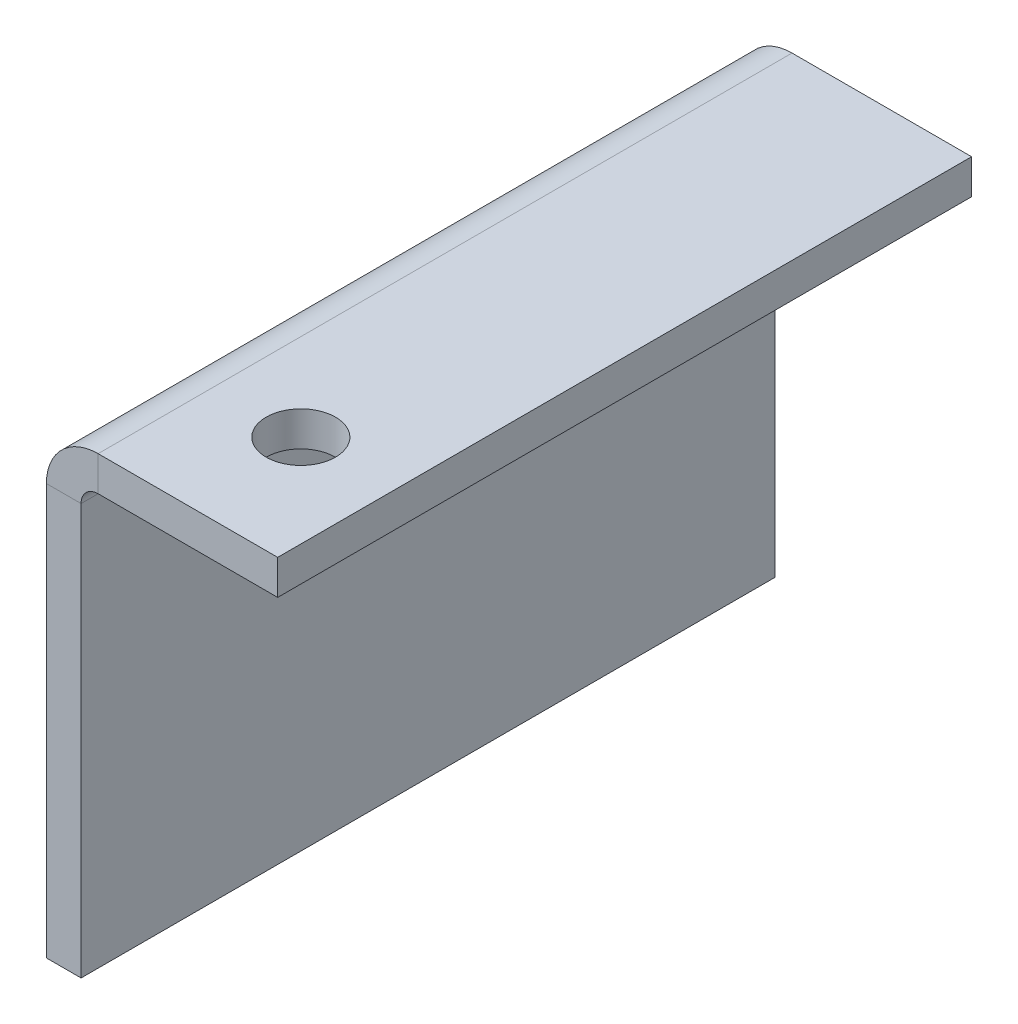
ISO-10303-21;
HEADER;
FILE_DESCRIPTION(('STEP AP214'),'2;1');
FILE_NAME('part.step','',(''),(''),'','','');
FILE_SCHEMA(('AUTOMOTIVE_DESIGN { 1 0 10303 214 1 1 1 1 }'));
ENDSEC;
DATA;
#1=APPLICATION_CONTEXT('core data for automotive mechanical design processes');
#2=APPLICATION_PROTOCOL_DEFINITION('international standard','automotive_design',2000,#1);
#3=PRODUCT_CONTEXT('',#1,'mechanical');
#4=PRODUCT('Part','Part','',(#3));
#5=PRODUCT_RELATED_PRODUCT_CATEGORY('part','',(#4));
#6=PRODUCT_DEFINITION_FORMATION('','',#4);
#7=PRODUCT_DEFINITION_CONTEXT('part definition',#1,'design');
#8=PRODUCT_DEFINITION('design','',#6,#7);
#9=PRODUCT_DEFINITION_SHAPE('','',#8);
#10=(LENGTH_UNIT() NAMED_UNIT(*) SI_UNIT(.MILLI.,.METRE.));
#11=(NAMED_UNIT(*) PLANE_ANGLE_UNIT() SI_UNIT($,.RADIAN.));
#12=(NAMED_UNIT(*) SI_UNIT($,.STERADIAN.) SOLID_ANGLE_UNIT());
#13=UNCERTAINTY_MEASURE_WITH_UNIT(LENGTH_MEASURE(1.E-05),#10,'distance_accuracy_value','');
#14=(GEOMETRIC_REPRESENTATION_CONTEXT(3) GLOBAL_UNCERTAINTY_ASSIGNED_CONTEXT((#13)) GLOBAL_UNIT_ASSIGNED_CONTEXT((#10,
#11,#12)) REPRESENTATION_CONTEXT('',''));
#15=CARTESIAN_POINT('',(0.,0.,0.));
#16=DIRECTION('',(0.,0.,1.));
#17=DIRECTION('',(1.,0.,0.));
#18=AXIS2_PLACEMENT_3D('',#15,#16,#17);
#19=CARTESIAN_POINT('',(2.23659999999994,20.,30.));
#20=DIRECTION('',(0.,0.,1.));
#21=DIRECTION('',(1.,0.,0.));
#22=AXIS2_PLACEMENT_3D('',#19,#20,#21);
#23=PLANE('',#22);
#24=DIRECTION('',(0.,-1.,0.));
#25=VECTOR('',#24,1.);
#26=CARTESIAN_POINT('',(2.23659999999994,20.,30.));
#27=LINE('',#26,#25);
#28=CARTESIAN_POINT('',(2.23659999999994,20.,30.));
#29=VERTEX_POINT('',#28);
#30=CARTESIAN_POINT('',(2.23659999999994,18.5,30.));
#31=VERTEX_POINT('',#30);
#32=EDGE_CURVE('E13',#29,#31,#27,.T.);
#33=ORIENTED_EDGE('',*,*,#32,.F.);
#34=CARTESIAN_POINT('',(2.23659999999994,17.7634,30.));
#35=DIRECTION('',(0.,0.,1.));
#36=DIRECTION('',(1.,0.,0.));
#37=AXIS2_PLACEMENT_3D('',#34,#35,#36);
#38=CIRCLE('',#37,2.2366);
#39=CARTESIAN_POINT('',(0.,17.7634,30.));
#40=VERTEX_POINT('',#39);
#41=EDGE_CURVE('E145',#40,#29,#38,.F.);
#42=ORIENTED_EDGE('',*,*,#41,.F.);
#43=DIRECTION('',(-1.,0.,0.));
#44=VECTOR('',#43,1.);
#45=CARTESIAN_POINT('',(1.49999999999994,17.7634,30.));
#46=LINE('',#45,#44);
#47=CARTESIAN_POINT('',(1.49999999999994,17.7634,30.));
#48=VERTEX_POINT('',#47);
#49=EDGE_CURVE('E56',#48,#40,#46,.T.);
#50=ORIENTED_EDGE('',*,*,#49,.F.);
#51=CARTESIAN_POINT('',(2.23659999999994,17.7634,30.));
#52=DIRECTION('',(0.,0.,1.));
#53=DIRECTION('',(1.,0.,0.));
#54=AXIS2_PLACEMENT_3D('',#51,#52,#53);
#55=CIRCLE('',#54,0.7366);
#56=EDGE_CURVE('E138',#48,#31,#55,.F.);
#57=ORIENTED_EDGE('',*,*,#56,.T.);
#58=EDGE_LOOP('',(#33,#42,#50,#57));
#59=FACE_BOUND('',#58,.T.);
#60=ADVANCED_FACE('F48',(#59),#23,.T.);
#61=CARTESIAN_POINT('',(1.49999999999994,17.7634,30.));
#62=DIRECTION('',(0.,0.,1.));
#63=DIRECTION('',(1.,0.,0.));
#64=AXIS2_PLACEMENT_3D('',#61,#62,#63);
#65=PLANE('',#64);
#66=DIRECTION('',(1.,0.,0.));
#67=VECTOR('',#66,1.);
#68=CARTESIAN_POINT('',(0.,20.,30.));
#69=LINE('',#68,#67);
#70=CARTESIAN_POINT('',(9.99999999999993,20.,30.));
#71=VERTEX_POINT('',#70);
#72=EDGE_CURVE('E195',#29,#71,#69,.T.);
#73=ORIENTED_EDGE('',*,*,#72,.F.);
#74=ORIENTED_EDGE('',*,*,#32,.T.);
#75=DIRECTION('',(1.,0.,0.));
#76=VECTOR('',#75,1.);
#77=CARTESIAN_POINT('',(0.,18.5,30.));
#78=LINE('',#77,#76);
#79=CARTESIAN_POINT('',(9.99999999999993,18.5,30.));
#80=VERTEX_POINT('',#79);
#81=EDGE_CURVE('E104',#31,#80,#78,.T.);
#82=ORIENTED_EDGE('',*,*,#81,.T.);
#83=DIRECTION('',(0.,-1.,0.));
#84=VECTOR('',#83,1.);
#85=CARTESIAN_POINT('',(9.99999999999993,20.,30.));
#86=LINE('',#85,#84);
#87=EDGE_CURVE('E346',#71,#80,#86,.T.);
#88=ORIENTED_EDGE('',*,*,#87,.F.);
#89=EDGE_LOOP('',(#73,#74,#82,#88));
#90=FACE_BOUND('',#89,.T.);
#91=ADVANCED_FACE('F203',(#90),#65,.T.);
#92=CARTESIAN_POINT('',(0.,17.7634,0.));
#93=DIRECTION('',(0.,0.,-1.));
#94=DIRECTION('',(-1.,0.,0.));
#95=AXIS2_PLACEMENT_3D('',#92,#93,#94);
#96=PLANE('',#95);
#97=DIRECTION('',(1.,0.,0.));
#98=VECTOR('',#97,1.);
#99=CARTESIAN_POINT('',(0.,17.7634,0.));
#100=LINE('',#99,#98);
#101=CARTESIAN_POINT('',(0.,17.7634,0.));
#102=VERTEX_POINT('',#101);
#103=CARTESIAN_POINT('',(1.49999999999994,17.7634,0.));
#104=VERTEX_POINT('',#103);
#105=EDGE_CURVE('E91',#102,#104,#100,.T.);
#106=ORIENTED_EDGE('',*,*,#105,.F.);
#107=CARTESIAN_POINT('',(2.23659999999994,17.7634,0.));
#108=DIRECTION('',(0.,0.,1.));
#109=DIRECTION('',(1.,0.,0.));
#110=AXIS2_PLACEMENT_3D('',#107,#108,#109);
#111=CIRCLE('',#110,2.2366);
#112=CARTESIAN_POINT('',(2.23659999999994,20.,0.));
#113=VERTEX_POINT('',#112);
#114=EDGE_CURVE('E161',#102,#113,#111,.F.);
#115=ORIENTED_EDGE('',*,*,#114,.T.);
#116=DIRECTION('',(0.,1.,0.));
#117=VECTOR('',#116,1.);
#118=CARTESIAN_POINT('',(2.23659999999994,18.5,0.));
#119=LINE('',#118,#117);
#120=CARTESIAN_POINT('',(2.23659999999994,18.5,0.));
#121=VERTEX_POINT('',#120);
#122=EDGE_CURVE('E98',#121,#113,#119,.T.);
#123=ORIENTED_EDGE('',*,*,#122,.F.);
#124=CARTESIAN_POINT('',(2.23659999999994,17.7634,0.));
#125=DIRECTION('',(0.,0.,1.));
#126=DIRECTION('',(1.,0.,0.));
#127=AXIS2_PLACEMENT_3D('',#124,#125,#126);
#128=CIRCLE('',#127,0.7366);
#129=EDGE_CURVE('E168',#104,#121,#128,.F.);
#130=ORIENTED_EDGE('',*,*,#129,.F.);
#131=EDGE_LOOP('',(#106,#115,#123,#130));
#132=FACE_BOUND('',#131,.T.);
#133=ADVANCED_FACE('F201',(#132),#96,.T.);
#134=CARTESIAN_POINT('',(2.23659999999994,18.5,0.));
#135=DIRECTION('',(0.,0.,-1.));
#136=DIRECTION('',(-1.,0.,0.));
#137=AXIS2_PLACEMENT_3D('',#134,#135,#136);
#138=PLANE('',#137);
#139=DIRECTION('',(0.,1.,0.));
#140=VECTOR('',#139,1.);
#141=CARTESIAN_POINT('',(0.,0.,0.));
#142=LINE('',#141,#140);
#143=CARTESIAN_POINT('',(0.,0.,0.));
#144=VERTEX_POINT('',#143);
#145=EDGE_CURVE('E163',#144,#102,#142,.T.);
#146=ORIENTED_EDGE('',*,*,#145,.T.);
#147=ORIENTED_EDGE('',*,*,#105,.T.);
#148=DIRECTION('',(0.,1.,0.));
#149=VECTOR('',#148,1.);
#150=CARTESIAN_POINT('',(1.5,0.,0.));
#151=LINE('',#150,#149);
#152=CARTESIAN_POINT('',(1.5,0.,0.));
#153=VERTEX_POINT('',#152);
#154=EDGE_CURVE('E166',#153,#104,#151,.T.);
#155=ORIENTED_EDGE('',*,*,#154,.F.);
#156=DIRECTION('',(-1.,0.,0.));
#157=VECTOR('',#156,1.);
#158=CARTESIAN_POINT('',(1.5,0.,0.));
#159=LINE('',#158,#157);
#160=EDGE_CURVE('E126',#153,#144,#159,.T.);
#161=ORIENTED_EDGE('',*,*,#160,.T.);
#162=EDGE_LOOP('',(#146,#147,#155,#161));
#163=FACE_BOUND('',#162,.T.);
#164=ADVANCED_FACE('F197',(#163),#138,.T.);
#165=CARTESIAN_POINT('',(0.,18.5,30.));
#166=DIRECTION('',(0.,1.,0.));
#167=DIRECTION('',(0.,0.,1.));
#168=AXIS2_PLACEMENT_3D('',#165,#166,#167);
#169=PLANE('',#168);
#170=CARTESIAN_POINT('',(5.99999999999993,18.5,25.));
#171=DIRECTION('',(0.,-1.,0.));
#172=DIRECTION('',(0.,0.,-1.));
#173=AXIS2_PLACEMENT_3D('',#170,#171,#172);
#174=CIRCLE('',#173,1.49999999999999);
#175=CARTESIAN_POINT('',(5.99999999999993,18.5,23.5));
#176=VERTEX_POINT('',#175);
#177=EDGE_CURVE('E341',#176,#176,#174,.T.);
#178=ORIENTED_EDGE('',*,*,#177,.F.);
#179=EDGE_LOOP('',(#178));
#180=FACE_BOUND('',#179,.T.);
#181=DIRECTION('',(1.,0.,0.));
#182=VECTOR('',#181,1.);
#183=CARTESIAN_POINT('',(0.,18.5,0.));
#184=LINE('',#183,#182);
#185=CARTESIAN_POINT('',(9.99999999999993,18.5,0.));
#186=VERTEX_POINT('',#185);
#187=EDGE_CURVE('E151',#121,#186,#184,.T.);
#188=ORIENTED_EDGE('',*,*,#187,.T.);
#189=DIRECTION('',(0.,0.,-1.));
#190=VECTOR('',#189,1.);
#191=CARTESIAN_POINT('',(9.99999999999993,18.5,30.));
#192=LINE('',#191,#190);
#193=EDGE_CURVE('E182',#80,#186,#192,.T.);
#194=ORIENTED_EDGE('',*,*,#193,.F.);
#195=ORIENTED_EDGE('',*,*,#81,.F.);
#196=DIRECTION('',(0.,0.,-1.));
#197=VECTOR('',#196,1.);
#198=CARTESIAN_POINT('',(2.23659999999994,18.5,30.));
#199=LINE('',#198,#197);
#200=EDGE_CURVE('E150',#31,#121,#199,.T.);
#201=ORIENTED_EDGE('',*,*,#200,.T.);
#202=EDGE_LOOP('',(#188,#194,#195,#201));
#203=FACE_BOUND('',#202,.T.);
#204=ADVANCED_FACE('F209',(#180,#203),#169,.F.);
#205=CARTESIAN_POINT('',(9.99999999999993,20.,30.));
#206=DIRECTION('',(1.,0.,0.));
#207=DIRECTION('',(0.,0.,-1.));
#208=AXIS2_PLACEMENT_3D('',#205,#206,#207);
#209=PLANE('',#208);
#210=DIRECTION('',(0.,-1.,0.));
#211=VECTOR('',#210,1.);
#212=CARTESIAN_POINT('',(9.99999999999993,20.,0.));
#213=LINE('',#212,#211);
#214=CARTESIAN_POINT('',(9.99999999999993,20.,0.));
#215=VERTEX_POINT('',#214);
#216=EDGE_CURVE('E154',#215,#186,#213,.T.);
#217=ORIENTED_EDGE('',*,*,#216,.F.);
#218=DIRECTION('',(0.,0.,-1.));
#219=VECTOR('',#218,1.);
#220=CARTESIAN_POINT('',(9.99999999999993,20.,30.));
#221=LINE('',#220,#219);
#222=EDGE_CURVE('E180',#71,#215,#221,.T.);
#223=ORIENTED_EDGE('',*,*,#222,.F.);
#224=ORIENTED_EDGE('',*,*,#87,.T.);
#225=ORIENTED_EDGE('',*,*,#193,.T.);
#226=EDGE_LOOP('',(#217,#223,#224,#225));
#227=FACE_BOUND('',#226,.T.);
#228=ADVANCED_FACE('F238',(#227),#209,.T.);
#229=CARTESIAN_POINT('',(0.,20.,30.));
#230=DIRECTION('',(0.,1.,0.));
#231=DIRECTION('',(0.,0.,1.));
#232=AXIS2_PLACEMENT_3D('',#229,#230,#231);
#233=PLANE('',#232);
#234=CARTESIAN_POINT('',(5.99999999999993,20.,25.));
#235=DIRECTION('',(0.,-1.,0.));
#236=DIRECTION('',(0.,0.,-1.));
#237=AXIS2_PLACEMENT_3D('',#234,#235,#236);
#238=CIRCLE('',#237,1.5);
#239=CARTESIAN_POINT('',(5.99999999999993,20.,23.5));
#240=VERTEX_POINT('',#239);
#241=EDGE_CURVE('E155',#240,#240,#238,.T.);
#242=ORIENTED_EDGE('',*,*,#241,.T.);
#243=EDGE_LOOP('',(#242));
#244=FACE_BOUND('',#243,.T.);
#245=DIRECTION('',(1.,0.,0.));
#246=VECTOR('',#245,1.);
#247=CARTESIAN_POINT('',(0.,20.,0.));
#248=LINE('',#247,#246);
#249=EDGE_CURVE('E158',#113,#215,#248,.T.);
#250=ORIENTED_EDGE('',*,*,#249,.F.);
#251=DIRECTION('',(0.,0.,-1.));
#252=VECTOR('',#251,1.);
#253=CARTESIAN_POINT('',(2.23659999999994,20.,30.));
#254=LINE('',#253,#252);
#255=EDGE_CURVE('E177',#29,#113,#254,.T.);
#256=ORIENTED_EDGE('',*,*,#255,.F.);
#257=ORIENTED_EDGE('',*,*,#72,.T.);
#258=ORIENTED_EDGE('',*,*,#222,.T.);
#259=EDGE_LOOP('',(#250,#256,#257,#258));
#260=FACE_BOUND('',#259,.T.);
#261=ADVANCED_FACE('F243',(#244,#260),#233,.T.);
#262=CARTESIAN_POINT('',(2.23659999999994,17.7634,30.));
#263=DIRECTION('',(0.,0.,-1.));
#264=DIRECTION('',(-1.,0.,0.));
#265=AXIS2_PLACEMENT_3D('',#262,#263,#264);
#266=CYLINDRICAL_SURFACE('',#265,2.2366);
#267=ORIENTED_EDGE('',*,*,#114,.F.);
#268=DIRECTION('',(0.,0.,-1.));
#269=VECTOR('',#268,1.);
#270=CARTESIAN_POINT('',(0.,17.7634,30.));
#271=LINE('',#270,#269);
#272=EDGE_CURVE('E174',#40,#102,#271,.T.);
#273=ORIENTED_EDGE('',*,*,#272,.F.);
#274=ORIENTED_EDGE('',*,*,#41,.T.);
#275=ORIENTED_EDGE('',*,*,#255,.T.);
#276=EDGE_LOOP('',(#267,#273,#274,#275));
#277=FACE_BOUND('',#276,.T.);
#278=ADVANCED_FACE('F191',(#277),#266,.T.);
#279=CARTESIAN_POINT('',(0.,0.,30.));
#280=DIRECTION('',(-1.,0.,0.));
#281=DIRECTION('',(0.,-1.,0.));
#282=AXIS2_PLACEMENT_3D('',#279,#280,#281);
#283=PLANE('',#282);
#284=ORIENTED_EDGE('',*,*,#145,.F.);
#285=DIRECTION('',(0.,0.,-1.));
#286=VECTOR('',#285,1.);
#287=CARTESIAN_POINT('',(0.,0.,30.));
#288=LINE('',#287,#286);
#289=CARTESIAN_POINT('',(0.,0.,30.));
#290=VERTEX_POINT('',#289);
#291=EDGE_CURVE('E128',#290,#144,#288,.T.);
#292=ORIENTED_EDGE('',*,*,#291,.F.);
#293=DIRECTION('',(0.,1.,0.));
#294=VECTOR('',#293,1.);
#295=CARTESIAN_POINT('',(0.,0.,30.));
#296=LINE('',#295,#294);
#297=EDGE_CURVE('E143',#290,#40,#296,.T.);
#298=ORIENTED_EDGE('',*,*,#297,.T.);
#299=ORIENTED_EDGE('',*,*,#272,.T.);
#300=EDGE_LOOP('',(#284,#292,#298,#299));
#301=FACE_BOUND('',#300,.T.);
#302=ADVANCED_FACE('F196',(#301),#283,.T.);
#303=CARTESIAN_POINT('',(1.5,0.,30.));
#304=DIRECTION('',(0.,-1.,0.));
#305=DIRECTION('',(1.,0.,0.));
#306=AXIS2_PLACEMENT_3D('',#303,#304,#305);
#307=PLANE('',#306);
#308=ORIENTED_EDGE('',*,*,#160,.F.);
#309=DIRECTION('',(0.,0.,-1.));
#310=VECTOR('',#309,1.);
#311=CARTESIAN_POINT('',(1.5,0.,30.));
#312=LINE('',#311,#310);
#313=CARTESIAN_POINT('',(1.5,0.,30.));
#314=VERTEX_POINT('',#313);
#315=EDGE_CURVE('E120',#314,#153,#312,.T.);
#316=ORIENTED_EDGE('',*,*,#315,.F.);
#317=DIRECTION('',(-1.,0.,0.));
#318=VECTOR('',#317,1.);
#319=CARTESIAN_POINT('',(1.5,0.,30.));
#320=LINE('',#319,#318);
#321=EDGE_CURVE('E124',#314,#290,#320,.T.);
#322=ORIENTED_EDGE('',*,*,#321,.T.);
#323=ORIENTED_EDGE('',*,*,#291,.T.);
#324=EDGE_LOOP('',(#308,#316,#322,#323));
#325=FACE_BOUND('',#324,.T.);
#326=ADVANCED_FACE('F122',(#325),#307,.T.);
#327=CARTESIAN_POINT('',(1.5,0.,30.));
#328=DIRECTION('',(-1.,0.,0.));
#329=DIRECTION('',(0.,-1.,0.));
#330=AXIS2_PLACEMENT_3D('',#327,#328,#329);
#331=PLANE('',#330);
#332=ORIENTED_EDGE('',*,*,#154,.T.);
#333=DIRECTION('',(0.,0.,-1.));
#334=VECTOR('',#333,1.);
#335=CARTESIAN_POINT('',(1.49999999999994,17.7634,30.));
#336=LINE('',#335,#334);
#337=EDGE_CURVE('E129',#48,#104,#336,.T.);
#338=ORIENTED_EDGE('',*,*,#337,.F.);
#339=DIRECTION('',(0.,1.,0.));
#340=VECTOR('',#339,1.);
#341=CARTESIAN_POINT('',(1.5,0.,30.));
#342=LINE('',#341,#340);
#343=EDGE_CURVE('E133',#314,#48,#342,.T.);
#344=ORIENTED_EDGE('',*,*,#343,.F.);
#345=ORIENTED_EDGE('',*,*,#315,.T.);
#346=EDGE_LOOP('',(#332,#338,#344,#345));
#347=FACE_BOUND('',#346,.T.);
#348=ADVANCED_FACE('F134',(#347),#331,.F.);
#349=CARTESIAN_POINT('',(2.23659999999994,17.7634,30.));
#350=DIRECTION('',(0.,0.,-1.));
#351=DIRECTION('',(-1.,0.,0.));
#352=AXIS2_PLACEMENT_3D('',#349,#350,#351);
#353=CYLINDRICAL_SURFACE('',#352,0.7366);
#354=ORIENTED_EDGE('',*,*,#129,.T.);
#355=ORIENTED_EDGE('',*,*,#200,.F.);
#356=ORIENTED_EDGE('',*,*,#56,.F.);
#357=ORIENTED_EDGE('',*,*,#337,.T.);
#358=EDGE_LOOP('',(#354,#355,#356,#357));
#359=FACE_BOUND('',#358,.T.);
#360=ADVANCED_FACE('F199',(#359),#353,.F.);
#361=CARTESIAN_POINT('',(2.23659999999994,17.7634,30.));
#362=DIRECTION('',(0.,0.,1.));
#363=DIRECTION('',(1.,0.,0.));
#364=AXIS2_PLACEMENT_3D('',#361,#362,#363);
#365=PLANE('',#364);
#366=ORIENTED_EDGE('',*,*,#343,.T.);
#367=ORIENTED_EDGE('',*,*,#49,.T.);
#368=ORIENTED_EDGE('',*,*,#297,.F.);
#369=ORIENTED_EDGE('',*,*,#321,.F.);
#370=EDGE_LOOP('',(#366,#367,#368,#369));
#371=FACE_BOUND('',#370,.T.);
#372=ADVANCED_FACE('F141',(#371),#365,.T.);
#373=CARTESIAN_POINT('',(2.23659999999994,17.7634,0.));
#374=DIRECTION('',(0.,0.,1.));
#375=DIRECTION('',(1.,0.,0.));
#376=AXIS2_PLACEMENT_3D('',#373,#374,#375);
#377=PLANE('',#376);
#378=ORIENTED_EDGE('',*,*,#187,.F.);
#379=ORIENTED_EDGE('',*,*,#122,.T.);
#380=ORIENTED_EDGE('',*,*,#249,.T.);
#381=ORIENTED_EDGE('',*,*,#216,.T.);
#382=EDGE_LOOP('',(#378,#379,#380,#381));
#383=FACE_BOUND('',#382,.T.);
#384=ADVANCED_FACE('F301',(#383),#377,.F.);
#385=CARTESIAN_POINT('',(5.99999999999993,18.5,25.));
#386=DIRECTION('',(0.,-1.,0.));
#387=DIRECTION('',(0.,0.,-1.));
#388=AXIS2_PLACEMENT_3D('',#385,#386,#387);
#389=CYLINDRICAL_SURFACE('',#388,1.49999999999999);
#390=ORIENTED_EDGE('',*,*,#241,.F.);
#391=EDGE_LOOP('',(#390));
#392=FACE_BOUND('',#391,.T.);
#393=ORIENTED_EDGE('',*,*,#177,.T.);
#394=EDGE_LOOP('',(#393));
#395=FACE_BOUND('',#394,.T.);
#396=ADVANCED_FACE('F311',(#392,#395),#389,.F.);
#397=CLOSED_SHELL('',(#60,#91,#133,#164,#204,#228,#261,#278,#302,#326,#348,#360,#372,#384,#396));
#398=MANIFOLD_SOLID_BREP('B2',#397);
#399=ADVANCED_BREP_SHAPE_REPRESENTATION('',(#18,#398),#14);
#400=SHAPE_DEFINITION_REPRESENTATION(#9,#399);
ENDSEC;
END-ISO-10303-21;
